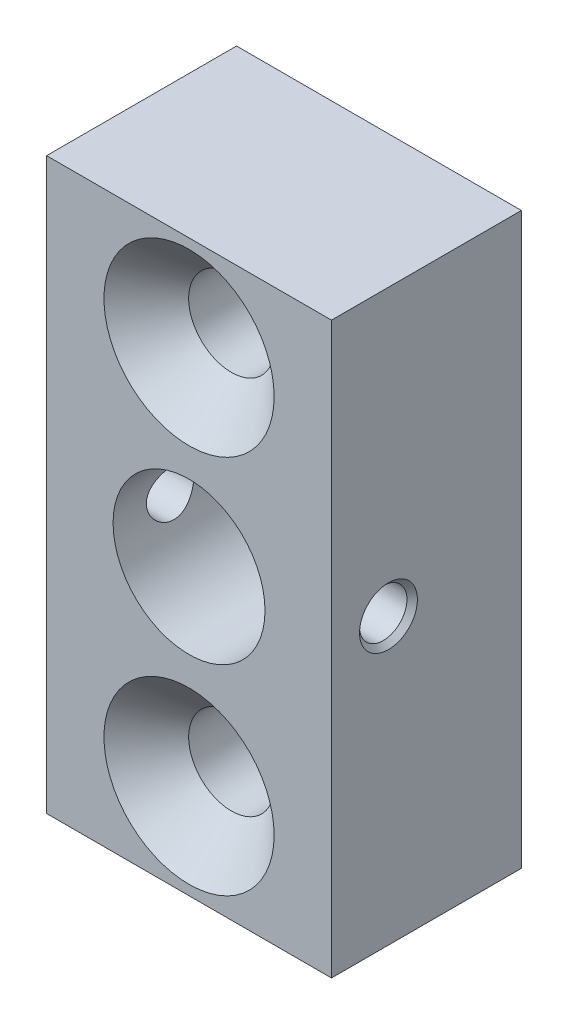
ISO-10303-21;
HEADER;
FILE_DESCRIPTION(('STEP AP214'),'2;1');
FILE_NAME('part.step','',(''),(''),'','','');
FILE_SCHEMA(('AUTOMOTIVE_DESIGN { 1 0 10303 214 1 1 1 1 }'));
ENDSEC;
DATA;
#1=APPLICATION_CONTEXT('core data for automotive mechanical design processes');
#2=APPLICATION_PROTOCOL_DEFINITION('international standard','automotive_design',2000,#1);
#3=PRODUCT_CONTEXT('',#1,'mechanical');
#4=PRODUCT('Part','Part','',(#3));
#5=PRODUCT_RELATED_PRODUCT_CATEGORY('part','',(#4));
#6=PRODUCT_DEFINITION_FORMATION('','',#4);
#7=PRODUCT_DEFINITION_CONTEXT('part definition',#1,'design');
#8=PRODUCT_DEFINITION('design','',#6,#7);
#9=PRODUCT_DEFINITION_SHAPE('','',#8);
#10=(LENGTH_UNIT() NAMED_UNIT(*) SI_UNIT(.MILLI.,.METRE.));
#11=(NAMED_UNIT(*) PLANE_ANGLE_UNIT() SI_UNIT($,.RADIAN.));
#12=(NAMED_UNIT(*) SI_UNIT($,.STERADIAN.) SOLID_ANGLE_UNIT());
#13=UNCERTAINTY_MEASURE_WITH_UNIT(LENGTH_MEASURE(1.E-05),#10,'distance_accuracy_value','');
#14=(GEOMETRIC_REPRESENTATION_CONTEXT(3) GLOBAL_UNCERTAINTY_ASSIGNED_CONTEXT((#13)) GLOBAL_UNIT_ASSIGNED_CONTEXT((#10,
#11,#12)) REPRESENTATION_CONTEXT('',''));
#15=CARTESIAN_POINT('',(0.,0.,0.));
#16=DIRECTION('',(0.,0.,1.));
#17=DIRECTION('',(1.,0.,0.));
#18=AXIS2_PLACEMENT_3D('',#15,#16,#17);
#19=CARTESIAN_POINT('',(7.5,5.,10.));
#20=DIRECTION('',(0.,0.,1.));
#21=DIRECTION('',(1.,0.,0.));
#22=AXIS2_PLACEMENT_3D('',#19,#20,#21);
#23=CYLINDRICAL_SURFACE('',#22,2.25);
#24=CARTESIAN_POINT('',(7.5,5.,7.77));
#25=DIRECTION('',(0.,0.,1.));
#26=DIRECTION('',(1.,0.,0.));
#27=AXIS2_PLACEMENT_3D('',#24,#25,#26);
#28=CIRCLE('',#27,2.25);
#29=CARTESIAN_POINT('',(9.75,5.,7.77));
#30=VERTEX_POINT('',#29);
#31=EDGE_CURVE('E120',#30,#30,#28,.T.);
#32=ORIENTED_EDGE('',*,*,#31,.T.);
#33=EDGE_LOOP('',(#32));
#34=FACE_BOUND('',#33,.T.);
#35=CARTESIAN_POINT('',(7.5,5.,4.));
#36=DIRECTION('',(0.,0.,-1.));
#37=DIRECTION('',(-1.,0.,0.));
#38=AXIS2_PLACEMENT_3D('',#35,#36,#37);
#39=CIRCLE('',#38,2.25);
#40=CARTESIAN_POINT('',(5.25,5.,4.));
#41=VERTEX_POINT('',#40);
#42=EDGE_CURVE('E129',#41,#41,#39,.F.);
#43=ORIENTED_EDGE('',*,*,#42,.F.);
#44=EDGE_LOOP('',(#43));
#45=FACE_BOUND('',#44,.T.);
#46=ADVANCED_FACE('F45',(#34,#45),#23,.F.);
#47=CARTESIAN_POINT('',(7.5,25.,10.));
#48=DIRECTION('',(0.,0.,1.));
#49=DIRECTION('',(1.,0.,0.));
#50=AXIS2_PLACEMENT_3D('',#47,#48,#49);
#51=CYLINDRICAL_SURFACE('',#50,2.25);
#52=CARTESIAN_POINT('',(7.5,25.,7.77));
#53=DIRECTION('',(0.,0.,1.));
#54=DIRECTION('',(1.,0.,0.));
#55=AXIS2_PLACEMENT_3D('',#52,#53,#54);
#56=CIRCLE('',#55,2.25);
#57=CARTESIAN_POINT('',(9.74999999999999,25.,7.77));
#58=VERTEX_POINT('',#57);
#59=EDGE_CURVE('E206',#58,#58,#56,.T.);
#60=ORIENTED_EDGE('',*,*,#59,.T.);
#61=EDGE_LOOP('',(#60));
#62=FACE_BOUND('',#61,.T.);
#63=CARTESIAN_POINT('',(7.5,25.,4.));
#64=DIRECTION('',(0.,0.,-1.));
#65=DIRECTION('',(-1.,0.,0.));
#66=AXIS2_PLACEMENT_3D('',#63,#64,#65);
#67=CIRCLE('',#66,2.25);
#68=CARTESIAN_POINT('',(5.25,25.,4.));
#69=VERTEX_POINT('',#68);
#70=EDGE_CURVE('E126',#69,#69,#67,.F.);
#71=ORIENTED_EDGE('',*,*,#70,.F.);
#72=EDGE_LOOP('',(#71));
#73=FACE_BOUND('',#72,.T.);
#74=ADVANCED_FACE('F165',(#62,#73),#51,.F.);
#75=CARTESIAN_POINT('',(0.,0.,0.));
#76=DIRECTION('',(0.,0.,-1.));
#77=DIRECTION('',(-1.,0.,0.));
#78=AXIS2_PLACEMENT_3D('',#75,#76,#77);
#79=PLANE('',#78);
#80=CARTESIAN_POINT('',(7.5,25.,0.));
#81=DIRECTION('',(0.,0.,-1.));
#82=DIRECTION('',(-1.,0.,0.));
#83=AXIS2_PLACEMENT_3D('',#80,#81,#82);
#84=CIRCLE('',#83,3.1);
#85=CARTESIAN_POINT('',(4.39999999999999,25.,0.));
#86=VERTEX_POINT('',#85);
#87=EDGE_CURVE('E218',#86,#86,#84,.T.);
#88=ORIENTED_EDGE('',*,*,#87,.F.);
#89=EDGE_LOOP('',(#88));
#90=FACE_BOUND('',#89,.T.);
#91=CARTESIAN_POINT('',(7.5,5.,0.));
#92=DIRECTION('',(0.,0.,-1.));
#93=DIRECTION('',(-1.,0.,0.));
#94=AXIS2_PLACEMENT_3D('',#91,#92,#93);
#95=CIRCLE('',#94,3.1);
#96=CARTESIAN_POINT('',(4.4,5.,0.));
#97=VERTEX_POINT('',#96);
#98=EDGE_CURVE('E211',#97,#97,#95,.T.);
#99=ORIENTED_EDGE('',*,*,#98,.F.);
#100=EDGE_LOOP('',(#99));
#101=FACE_BOUND('',#100,.T.);
#102=DIRECTION('',(0.,-1.,0.));
#103=VECTOR('',#102,1.);
#104=CARTESIAN_POINT('',(0.,0.,0.));
#105=LINE('',#104,#103);
#106=CARTESIAN_POINT('',(0.,30.,0.));
#107=VERTEX_POINT('',#106);
#108=CARTESIAN_POINT('',(0.,0.,0.));
#109=VERTEX_POINT('',#108);
#110=EDGE_CURVE('E117',#107,#109,#105,.T.);
#111=ORIENTED_EDGE('',*,*,#110,.F.);
#112=DIRECTION('',(-1.,0.,0.));
#113=VECTOR('',#112,1.);
#114=CARTESIAN_POINT('',(0.,30.,0.));
#115=LINE('',#114,#113);
#116=CARTESIAN_POINT('',(15.,30.,0.));
#117=VERTEX_POINT('',#116);
#118=EDGE_CURVE('E92',#117,#107,#115,.T.);
#119=ORIENTED_EDGE('',*,*,#118,.F.);
#120=DIRECTION('',(0.,1.,0.));
#121=VECTOR('',#120,1.);
#122=CARTESIAN_POINT('',(15.,0.,0.));
#123=LINE('',#122,#121);
#124=CARTESIAN_POINT('',(15.,0.,0.));
#125=VERTEX_POINT('',#124);
#126=EDGE_CURVE('E86',#125,#117,#123,.T.);
#127=ORIENTED_EDGE('',*,*,#126,.F.);
#128=DIRECTION('',(1.,0.,0.));
#129=VECTOR('',#128,1.);
#130=CARTESIAN_POINT('',(0.,0.,0.));
#131=LINE('',#130,#129);
#132=EDGE_CURVE('E108',#109,#125,#131,.T.);
#133=ORIENTED_EDGE('',*,*,#132,.F.);
#134=EDGE_LOOP('',(#111,#119,#127,#133));
#135=FACE_BOUND('',#134,.T.);
#136=ADVANCED_FACE('F172',(#90,#101,#135),#79,.T.);
#137=CARTESIAN_POINT('',(0.,0.,10.));
#138=DIRECTION('',(1.,0.,0.));
#139=DIRECTION('',(0.,0.,-1.));
#140=AXIS2_PLACEMENT_3D('',#137,#138,#139);
#141=PLANE('',#140);
#142=CARTESIAN_POINT('',(0.,15.,7.00000000000001));
#143=DIRECTION('',(1.,0.,0.));
#144=DIRECTION('',(0.,0.,-1.));
#145=AXIS2_PLACEMENT_3D('',#142,#143,#144);
#146=CIRCLE('',#145,1.25);
#147=CARTESIAN_POINT('',(0.,15.,5.75000000000001));
#148=VERTEX_POINT('',#147);
#149=EDGE_CURVE('E138',#148,#148,#146,.T.);
#150=ORIENTED_EDGE('',*,*,#149,.T.);
#151=EDGE_LOOP('',(#150));
#152=FACE_BOUND('',#151,.T.);
#153=ORIENTED_EDGE('',*,*,#110,.T.);
#154=DIRECTION('',(0.,0.,-1.));
#155=VECTOR('',#154,1.);
#156=CARTESIAN_POINT('',(0.,0.,10.));
#157=LINE('',#156,#155);
#158=CARTESIAN_POINT('',(0.,0.,10.));
#159=VERTEX_POINT('',#158);
#160=EDGE_CURVE('E11',#159,#109,#157,.T.);
#161=ORIENTED_EDGE('',*,*,#160,.F.);
#162=DIRECTION('',(0.,-1.,0.));
#163=VECTOR('',#162,1.);
#164=CARTESIAN_POINT('',(0.,0.,10.));
#165=LINE('',#164,#163);
#166=CARTESIAN_POINT('',(0.,30.,10.));
#167=VERTEX_POINT('',#166);
#168=EDGE_CURVE('E104',#167,#159,#165,.T.);
#169=ORIENTED_EDGE('',*,*,#168,.F.);
#170=DIRECTION('',(0.,0.,-1.));
#171=VECTOR('',#170,1.);
#172=CARTESIAN_POINT('',(0.,30.,10.));
#173=LINE('',#172,#171);
#174=EDGE_CURVE('E113',#167,#107,#173,.T.);
#175=ORIENTED_EDGE('',*,*,#174,.T.);
#176=EDGE_LOOP('',(#153,#161,#169,#175));
#177=FACE_BOUND('',#176,.T.);
#178=ADVANCED_FACE('F47',(#152,#177),#141,.F.);
#179=CARTESIAN_POINT('',(0.,0.,10.));
#180=DIRECTION('',(0.,1.,0.));
#181=DIRECTION('',(0.,0.,1.));
#182=AXIS2_PLACEMENT_3D('',#179,#180,#181);
#183=PLANE('',#182);
#184=ORIENTED_EDGE('',*,*,#132,.T.);
#185=DIRECTION('',(0.,0.,-1.));
#186=VECTOR('',#185,1.);
#187=CARTESIAN_POINT('',(15.,0.,10.));
#188=LINE('',#187,#186);
#189=CARTESIAN_POINT('',(15.,0.,10.));
#190=VERTEX_POINT('',#189);
#191=EDGE_CURVE('E60',#190,#125,#188,.T.);
#192=ORIENTED_EDGE('',*,*,#191,.F.);
#193=DIRECTION('',(1.,0.,0.));
#194=VECTOR('',#193,1.);
#195=CARTESIAN_POINT('',(0.,0.,10.));
#196=LINE('',#195,#194);
#197=EDGE_CURVE('E99',#159,#190,#196,.T.);
#198=ORIENTED_EDGE('',*,*,#197,.F.);
#199=ORIENTED_EDGE('',*,*,#160,.T.);
#200=EDGE_LOOP('',(#184,#192,#198,#199));
#201=FACE_BOUND('',#200,.T.);
#202=ADVANCED_FACE('F107',(#201),#183,.F.);
#203=CARTESIAN_POINT('',(15.,0.,10.));
#204=DIRECTION('',(-1.,0.,0.));
#205=DIRECTION('',(0.,0.,1.));
#206=AXIS2_PLACEMENT_3D('',#203,#204,#205);
#207=PLANE('',#206);
#208=CARTESIAN_POINT('',(15.,15.,7.00000000000001));
#209=DIRECTION('',(1.,0.,0.));
#210=DIRECTION('',(0.,0.,-1.));
#211=AXIS2_PLACEMENT_3D('',#208,#209,#210);
#212=CIRCLE('',#211,1.525);
#213=CARTESIAN_POINT('',(15.,15.,5.47500000000001));
#214=VERTEX_POINT('',#213);
#215=EDGE_CURVE('E231',#214,#214,#212,.T.);
#216=ORIENTED_EDGE('',*,*,#215,.F.);
#217=EDGE_LOOP('',(#216));
#218=FACE_BOUND('',#217,.T.);
#219=ORIENTED_EDGE('',*,*,#126,.T.);
#220=DIRECTION('',(0.,0.,-1.));
#221=VECTOR('',#220,1.);
#222=CARTESIAN_POINT('',(15.,30.,10.));
#223=LINE('',#222,#221);
#224=CARTESIAN_POINT('',(15.,30.,10.));
#225=VERTEX_POINT('',#224);
#226=EDGE_CURVE('E109',#225,#117,#223,.T.);
#227=ORIENTED_EDGE('',*,*,#226,.F.);
#228=DIRECTION('',(0.,1.,0.));
#229=VECTOR('',#228,1.);
#230=CARTESIAN_POINT('',(15.,0.,10.));
#231=LINE('',#230,#229);
#232=EDGE_CURVE('E102',#190,#225,#231,.T.);
#233=ORIENTED_EDGE('',*,*,#232,.F.);
#234=ORIENTED_EDGE('',*,*,#191,.T.);
#235=EDGE_LOOP('',(#219,#227,#233,#234));
#236=FACE_BOUND('',#235,.T.);
#237=ADVANCED_FACE('F111',(#218,#236),#207,.F.);
#238=CARTESIAN_POINT('',(0.,30.,10.));
#239=DIRECTION('',(0.,-1.,0.));
#240=DIRECTION('',(0.,0.,-1.));
#241=AXIS2_PLACEMENT_3D('',#238,#239,#240);
#242=PLANE('',#241);
#243=ORIENTED_EDGE('',*,*,#118,.T.);
#244=ORIENTED_EDGE('',*,*,#174,.F.);
#245=DIRECTION('',(-1.,0.,0.));
#246=VECTOR('',#245,1.);
#247=CARTESIAN_POINT('',(0.,30.,10.));
#248=LINE('',#247,#246);
#249=EDGE_CURVE('E69',#225,#167,#248,.T.);
#250=ORIENTED_EDGE('',*,*,#249,.F.);
#251=ORIENTED_EDGE('',*,*,#226,.T.);
#252=EDGE_LOOP('',(#243,#244,#250,#251));
#253=FACE_BOUND('',#252,.T.);
#254=ADVANCED_FACE('F181',(#253),#242,.F.);
#255=CARTESIAN_POINT('',(0.,0.,10.));
#256=DIRECTION('',(0.,0.,-1.));
#257=DIRECTION('',(-1.,0.,0.));
#258=AXIS2_PLACEMENT_3D('',#255,#256,#257);
#259=PLANE('',#258);
#260=CARTESIAN_POINT('',(7.5,15.,10.));
#261=DIRECTION('',(0.,0.,1.));
#262=DIRECTION('',(1.,0.,0.));
#263=AXIS2_PLACEMENT_3D('',#260,#261,#262);
#264=CIRCLE('',#263,4.);
#265=CARTESIAN_POINT('',(11.5,15.,10.));
#266=VERTEX_POINT('',#265);
#267=EDGE_CURVE('E223',#266,#266,#264,.T.);
#268=ORIENTED_EDGE('',*,*,#267,.F.);
#269=EDGE_LOOP('',(#268));
#270=FACE_BOUND('',#269,.T.);
#271=CARTESIAN_POINT('',(7.5,25.,10.));
#272=DIRECTION('',(0.,0.,1.));
#273=DIRECTION('',(1.,0.,0.));
#274=AXIS2_PLACEMENT_3D('',#271,#272,#273);
#275=CIRCLE('',#274,4.48);
#276=CARTESIAN_POINT('',(11.98,25.,10.));
#277=VERTEX_POINT('',#276);
#278=EDGE_CURVE('E132',#277,#277,#275,.T.);
#279=ORIENTED_EDGE('',*,*,#278,.F.);
#280=EDGE_LOOP('',(#279));
#281=FACE_BOUND('',#280,.T.);
#282=CARTESIAN_POINT('',(7.5,5.,10.));
#283=DIRECTION('',(0.,0.,1.));
#284=DIRECTION('',(1.,0.,0.));
#285=AXIS2_PLACEMENT_3D('',#282,#283,#284);
#286=CIRCLE('',#285,4.48);
#287=CARTESIAN_POINT('',(11.98,5.,10.));
#288=VERTEX_POINT('',#287);
#289=EDGE_CURVE('E203',#288,#288,#286,.T.);
#290=ORIENTED_EDGE('',*,*,#289,.F.);
#291=EDGE_LOOP('',(#290));
#292=FACE_BOUND('',#291,.T.);
#293=ORIENTED_EDGE('',*,*,#168,.T.);
#294=ORIENTED_EDGE('',*,*,#197,.T.);
#295=ORIENTED_EDGE('',*,*,#232,.T.);
#296=ORIENTED_EDGE('',*,*,#249,.T.);
#297=EDGE_LOOP('',(#293,#294,#295,#296));
#298=FACE_BOUND('',#297,.T.);
#299=ADVANCED_FACE('F100',(#270,#281,#292,#298),#259,.F.);
#300=CARTESIAN_POINT('',(7.5,5.,10.));
#301=DIRECTION('',(0.,0.,1.));
#302=DIRECTION('',(1.,0.,0.));
#303=AXIS2_PLACEMENT_3D('',#300,#301,#302);
#304=CONICAL_SURFACE('',#303,4.48,0.785398163397449);
#305=ORIENTED_EDGE('',*,*,#31,.F.);
#306=EDGE_LOOP('',(#305));
#307=FACE_BOUND('',#306,.T.);
#308=ORIENTED_EDGE('',*,*,#289,.T.);
#309=EDGE_LOOP('',(#308));
#310=FACE_BOUND('',#309,.T.);
#311=ADVANCED_FACE('F179',(#307,#310),#304,.F.);
#312=CARTESIAN_POINT('',(7.5,25.,10.));
#313=DIRECTION('',(0.,0.,1.));
#314=DIRECTION('',(1.,0.,0.));
#315=AXIS2_PLACEMENT_3D('',#312,#313,#314);
#316=CONICAL_SURFACE('',#315,4.48,0.785398163397449);
#317=ORIENTED_EDGE('',*,*,#59,.F.);
#318=EDGE_LOOP('',(#317));
#319=FACE_BOUND('',#318,.T.);
#320=ORIENTED_EDGE('',*,*,#278,.T.);
#321=EDGE_LOOP('',(#320));
#322=FACE_BOUND('',#321,.T.);
#323=ADVANCED_FACE('F256',(#319,#322),#316,.F.);
#324=CARTESIAN_POINT('',(7.5,25.,4.));
#325=DIRECTION('',(0.,0.,-1.));
#326=DIRECTION('',(-1.,0.,0.));
#327=AXIS2_PLACEMENT_3D('',#324,#325,#326);
#328=PLANE('',#327);
#329=CARTESIAN_POINT('',(7.5,25.,4.));
#330=DIRECTION('',(0.,0.,-1.));
#331=DIRECTION('',(-1.,0.,0.));
#332=AXIS2_PLACEMENT_3D('',#329,#330,#331);
#333=CIRCLE('',#332,3.1);
#334=CARTESIAN_POINT('',(4.39999999999999,25.,4.));
#335=VERTEX_POINT('',#334);
#336=EDGE_CURVE('E130',#335,#335,#333,.T.);
#337=ORIENTED_EDGE('',*,*,#336,.T.);
#338=EDGE_LOOP('',(#337));
#339=FACE_BOUND('',#338,.T.);
#340=ORIENTED_EDGE('',*,*,#70,.T.);
#341=EDGE_LOOP('',(#340));
#342=FACE_BOUND('',#341,.T.);
#343=ADVANCED_FACE('F260',(#339,#342),#328,.T.);
#344=CARTESIAN_POINT('',(7.5,25.,4.));
#345=DIRECTION('',(0.,0.,-1.));
#346=DIRECTION('',(-1.,0.,0.));
#347=AXIS2_PLACEMENT_3D('',#344,#345,#346);
#348=CYLINDRICAL_SURFACE('',#347,3.1);
#349=ORIENTED_EDGE('',*,*,#336,.F.);
#350=EDGE_LOOP('',(#349));
#351=FACE_BOUND('',#350,.T.);
#352=ORIENTED_EDGE('',*,*,#87,.T.);
#353=EDGE_LOOP('',(#352));
#354=FACE_BOUND('',#353,.T.);
#355=ADVANCED_FACE('F267',(#351,#354),#348,.F.);
#356=CARTESIAN_POINT('',(7.5,5.,4.));
#357=DIRECTION('',(0.,0.,-1.));
#358=DIRECTION('',(-1.,0.,0.));
#359=AXIS2_PLACEMENT_3D('',#356,#357,#358);
#360=PLANE('',#359);
#361=CARTESIAN_POINT('',(7.5,5.,4.));
#362=DIRECTION('',(0.,0.,-1.));
#363=DIRECTION('',(-1.,0.,0.));
#364=AXIS2_PLACEMENT_3D('',#361,#362,#363);
#365=CIRCLE('',#364,3.1);
#366=CARTESIAN_POINT('',(4.4,5.,4.));
#367=VERTEX_POINT('',#366);
#368=EDGE_CURVE('E214',#367,#367,#365,.T.);
#369=ORIENTED_EDGE('',*,*,#368,.T.);
#370=EDGE_LOOP('',(#369));
#371=FACE_BOUND('',#370,.T.);
#372=ORIENTED_EDGE('',*,*,#42,.T.);
#373=EDGE_LOOP('',(#372));
#374=FACE_BOUND('',#373,.T.);
#375=ADVANCED_FACE('F274',(#371,#374),#360,.T.);
#376=CARTESIAN_POINT('',(7.5,5.,4.));
#377=DIRECTION('',(0.,0.,-1.));
#378=DIRECTION('',(-1.,0.,0.));
#379=AXIS2_PLACEMENT_3D('',#376,#377,#378);
#380=CYLINDRICAL_SURFACE('',#379,3.1);
#381=ORIENTED_EDGE('',*,*,#368,.F.);
#382=EDGE_LOOP('',(#381));
#383=FACE_BOUND('',#382,.T.);
#384=ORIENTED_EDGE('',*,*,#98,.T.);
#385=EDGE_LOOP('',(#384));
#386=FACE_BOUND('',#385,.T.);
#387=ADVANCED_FACE('F161',(#383,#386),#380,.F.);
#388=CARTESIAN_POINT('',(7.5,15.,4.));
#389=DIRECTION('',(0.,0.,1.));
#390=DIRECTION('',(1.,0.,0.));
#391=AXIS2_PLACEMENT_3D('',#388,#389,#390);
#392=CYLINDRICAL_SURFACE('',#391,4.);
#393=CARTESIAN_POINT('',(11.5,15.,5.75000000000001));
#394=CARTESIAN_POINT('',(11.4999996587799,15.0684391851745,5.75000044658758));
#395=CARTESIAN_POINT('',(11.4982269498484,15.1368830525029,5.75563922694446));
#396=CARTESIAN_POINT('',(11.4913289408881,15.2717692095884,5.77798624153924));
#397=CARTESIAN_POINT('',(11.4862028819986,15.3382110427259,5.79469698136437));
#398=CARTESIAN_POINT('',(11.4731581569791,15.4671285436508,5.83856937119574));
#399=CARTESIAN_POINT('',(11.4652438149903,15.5296101769858,5.86571484465297));
#400=CARTESIAN_POINT('',(11.4474396916109,15.6491348023465,5.92961731767834));
#401=CARTESIAN_POINT('',(11.4375495989991,15.7061769354449,5.96637583178059));
#402=CARTESIAN_POINT('',(11.4165021374028,15.8149653349523,6.04965599201737));
#403=CARTESIAN_POINT('',(11.4053171592699,15.8665200281567,6.09642088506108));
#404=CARTESIAN_POINT('',(11.3831004637421,15.961197382037,6.19786839241356));
#405=CARTESIAN_POINT('',(11.3720687752346,16.0043184728987,6.25255247749456));
#406=CARTESIAN_POINT('',(11.3511114469817,16.0819433648311,6.36994456380809));
#407=CARTESIAN_POINT('',(11.341219883018,16.1162078415013,6.43281747752723));
#408=CARTESIAN_POINT('',(11.3240780179923,16.1735974107667,6.56379231498188));
#409=CARTESIAN_POINT('',(11.3168270212869,16.1967254377194,6.63189285579394));
#410=CARTESIAN_POINT('',(11.306076069845,16.2304845993003,6.76922807745207));
#411=CARTESIAN_POINT('',(11.3024697292951,16.2414711000786,6.83836684363886));
#412=CARTESIAN_POINT('',(11.2991005514095,16.2517455503699,6.9775931189119));
#413=CARTESIAN_POINT('',(11.2993366922733,16.2510366099577,7.04768037082167));
#414=CARTESIAN_POINT('',(11.3035318907544,16.2382182473274,7.18387446026899));
#415=CARTESIAN_POINT('',(11.3073434174595,16.2265605786938,7.25002912586157));
#416=CARTESIAN_POINT('',(11.3180202565249,16.1929081335563,7.37939215653735));
#417=CARTESIAN_POINT('',(11.3248858934312,16.1709122584455,7.4426002077088));
#418=CARTESIAN_POINT('',(11.341010440143,16.1168887468128,7.56535194443264));
#419=CARTESIAN_POINT('',(11.3503028466082,16.0847192566208,7.62482861069199));
#420=CARTESIAN_POINT('',(11.3702185658007,16.0113602073785,7.73768776787913));
#421=CARTESIAN_POINT('',(11.3808422239455,15.9701683052158,7.79106867025372));
#422=CARTESIAN_POINT('',(11.4028152780049,15.8777169541821,7.89277494341699));
#423=CARTESIAN_POINT('',(11.414175696057,15.8260845705928,7.94075955777969));
#424=CARTESIAN_POINT('',(11.4359157075958,15.7153644080955,8.02747189357968));
#425=CARTESIAN_POINT('',(11.4462952283837,15.656276077349,8.06619892921921));
#426=CARTESIAN_POINT('',(11.4650129489019,15.5316646104655,8.13352768860128));
#427=CARTESIAN_POINT('',(11.4733346064821,15.4660949069193,8.16204813546397));
#428=CARTESIAN_POINT('',(11.4868795582855,15.3307679777826,8.20755300085157));
#429=CARTESIAN_POINT('',(11.4921037932515,15.2610120307246,8.2245409222384));
#430=CARTESIAN_POINT('',(11.4987138939501,15.1221851572903,8.24591804257898));
#431=CARTESIAN_POINT('',(11.5002402289544,15.0531918487888,8.25076854359353));
#432=CARTESIAN_POINT('',(11.4996979973098,14.9153696942674,8.24903377336267));
#433=CARTESIAN_POINT('',(11.4976299558112,14.8465408256935,8.2424501726774));
#434=CARTESIAN_POINT('',(11.4902236376977,14.7127806670242,8.21840440739361));
#435=CARTESIAN_POINT('',(11.4849679311073,14.6477950215791,8.20121673238749));
#436=CARTESIAN_POINT('',(11.4718012137925,14.5216480711386,8.15678564763332));
#437=CARTESIAN_POINT('',(11.463889875142,14.460487239551,8.1295409959751));
#438=CARTESIAN_POINT('',(11.4459854275957,14.3420675933278,8.06502678345121));
#439=CARTESIAN_POINT('',(11.4359462681821,14.284940260212,8.02752901250279));
#440=CARTESIAN_POINT('',(11.4149341000289,14.1776341490399,7.94384678988299));
#441=CARTESIAN_POINT('',(11.4039608384586,14.1274572619567,7.89765998225689));
#442=CARTESIAN_POINT('',(11.3817699488525,14.0334125370803,7.79574110994632));
#443=CARTESIAN_POINT('',(11.3705598671445,13.9898734766023,7.73970333625475));
#444=CARTESIAN_POINT('',(11.349619470876,13.9127874975509,7.62087338362926));
#445=CARTESIAN_POINT('',(11.339889132814,13.8792404202748,7.55808131199557));
#446=CARTESIAN_POINT('',(11.3231178236075,13.8232991651886,7.42765482711414));
#447=CARTESIAN_POINT('',(11.3160664646803,13.8008618044111,7.36004035049531));
#448=CARTESIAN_POINT('',(11.3055117094121,13.7677710567904,7.22172750667621));
#449=CARTESIAN_POINT('',(11.3020069630268,13.7571131858539,7.15103032362869));
#450=CARTESIAN_POINT('',(11.2990829271249,13.7482059384246,7.01199591244576));
#451=CARTESIAN_POINT('',(11.2994860468308,13.7494172037804,6.94369654618707));
#452=CARTESIAN_POINT('',(11.3039009047238,13.7629118187053,6.80832541508083));
#453=CARTESIAN_POINT('',(11.3079124745732,13.7751946517744,6.741253593116));
#454=CARTESIAN_POINT('',(11.3189681415811,13.8101227008662,6.61120596039822));
#455=CARTESIAN_POINT('',(11.3259669818347,13.8326135759406,6.54818455890399));
#456=CARTESIAN_POINT('',(11.3421970426135,13.8871977266494,6.42675958646866));
#457=CARTESIAN_POINT('',(11.3514287171652,13.9192929555575,6.36835695792232));
#458=CARTESIAN_POINT('',(11.3715348703158,13.9936432498653,6.25535402955944));
#459=CARTESIAN_POINT('',(11.3824594892244,14.0362466647587,6.20099187049957));
#460=CARTESIAN_POINT('',(11.4044899882173,14.1297910035952,6.10001367188821));
#461=CARTESIAN_POINT('',(11.4155959160679,14.1807341576556,6.053399711009));
#462=CARTESIAN_POINT('',(11.4371727195233,14.2915133371767,5.96771746163702));
#463=CARTESIAN_POINT('',(11.4476110173063,14.3515854255126,5.92894526355004));
#464=CARTESIAN_POINT('',(11.4662676929692,14.4777208619863,5.86210108486057));
#465=CARTESIAN_POINT('',(11.4744869431583,14.5437818422046,5.83402489785817));
#466=CARTESIAN_POINT('',(11.4872065073346,14.674252364626,5.79140863239154));
#467=CARTESIAN_POINT('',(11.4919624080614,14.7383296628875,5.77592513269467));
#468=CARTESIAN_POINT('',(11.4983590034049,14.8682701045598,5.75522164003229));
#469=CARTESIAN_POINT('',(11.5000003283964,14.9341328838603,5.749999570196));
#470=CARTESIAN_POINT('',(11.5,15.,5.75000000000001));
#471=B_SPLINE_CURVE_WITH_KNOTS('',3,(#393,#394,#395,#396,#397,#398,#399,#400,#401,#402,#403,
#404,#405,#406,#407,#408,#409,#410,#411,#412,#413,#414,#415,#416,#417,#418,#419,#420,#421,#422,
#423,#424,#425,#426,#427,#428,#429,#430,#431,#432,#433,#434,#435,#436,#437,#438,#439,#440,#441,
#442,#443,#444,#445,#446,#447,#448,#449,#450,#451,#452,#453,#454,#455,#456,#457,#458,#459,#460,
#461,#462,#463,#464,#465,#466,#467,#468,#469,#470),.UNSPECIFIED.,.T.,.F.,(4,2,2,2,2,2,2,2,2,2,2,
2,2,2,2,2,2,2,2,2,2,2,2,2,2,2,2,2,2,2,2,2,2,2,2,2,2,2,4),(0.,0.20507544943251,0.410197323349066,
0.615002479202435,0.819839921558388,1.03037822195158,1.24095567431276,1.45673771247494,
1.67246286279527,1.88169150167209,2.09086450295138,2.29176917422169,2.49269519979062,
2.69655642720545,2.90047066010358,3.11366747279599,3.32688007413303,3.5417546068977,
3.75656384494553,3.96307568548236,4.16955735649362,4.37090626722871,4.57228005034499,
4.77856324738342,4.98490245709258,5.19941778713139,5.41392970983711,5.6276011575103,
5.8411912389243,6.04512203476053,6.24904331751084,6.4499791339667,6.65095584330173,
6.85979514006361,7.06869037373339,7.28440668126411,7.50003806666336,7.6974463665154,
7.89481470763046),.UNSPECIFIED.);
#472=CARTESIAN_POINT('',(11.5,15.,5.75000000000001));
#473=VERTEX_POINT('',#472);
#474=EDGE_CURVE('E49',#473,#473,#471,.T.);
#475=ORIENTED_EDGE('',*,*,#474,.T.);
#476=EDGE_LOOP('',(#475));
#477=FACE_BOUND('',#476,.T.);
#478=CARTESIAN_POINT('',(3.5,15.,5.75000000000001));
#479=CARTESIAN_POINT('',(3.50000034122011,14.9315608148255,5.75000044658758));
#480=CARTESIAN_POINT('',(3.50177305015159,14.8631169474971,5.75563922694446));
#481=CARTESIAN_POINT('',(3.50867105911193,14.7282307904116,5.77798624153924));
#482=CARTESIAN_POINT('',(3.51379711800141,14.6617889572741,5.79469698136437));
#483=CARTESIAN_POINT('',(3.52684184302091,14.5328714563492,5.83856937119574));
#484=CARTESIAN_POINT('',(3.53475618500975,14.4703898230142,5.86571484465298));
#485=CARTESIAN_POINT('',(3.55256030838907,14.3508651976535,5.92961731767834));
#486=CARTESIAN_POINT('',(3.56245040100095,14.2938230645551,5.96637583178059));
#487=CARTESIAN_POINT('',(3.58349786259718,14.1850346650477,6.04965599201737));
#488=CARTESIAN_POINT('',(3.59468284073011,14.1334799718433,6.09642088506108));
#489=CARTESIAN_POINT('',(3.61689953625792,14.038802617963,6.19786839241356));
#490=CARTESIAN_POINT('',(3.62793122476543,13.9956815271013,6.25255247749455));
#491=CARTESIAN_POINT('',(3.64888855301828,13.9180566351689,6.36994456380809));
#492=CARTESIAN_POINT('',(3.65878011698204,13.8837921584987,6.43281747752723));
#493=CARTESIAN_POINT('',(3.67592198200766,13.8264025892333,6.56379231498188));
#494=CARTESIAN_POINT('',(3.68317297871311,13.8032745622806,6.63189285579394));
#495=CARTESIAN_POINT('',(3.69392393015499,13.7695154006997,6.76922807745207));
#496=CARTESIAN_POINT('',(3.69753027070492,13.7585288999214,6.83836684363886));
#497=CARTESIAN_POINT('',(3.7008994485905,13.7482544496301,6.9775931189119));
#498=CARTESIAN_POINT('',(3.70066330772666,13.7489633900423,7.04768037082167));
#499=CARTESIAN_POINT('',(3.69646810924562,13.7617817526726,7.18387446026899));
#500=CARTESIAN_POINT('',(3.69265658254051,13.7734394213062,7.25002912586157));
#501=CARTESIAN_POINT('',(3.68197974347511,13.8070918664437,7.37939215653735));
#502=CARTESIAN_POINT('',(3.67511410656885,13.8290877415545,7.4426002077088));
#503=CARTESIAN_POINT('',(3.65898955985703,13.8831112531872,7.56535194443264));
#504=CARTESIAN_POINT('',(3.64969715339176,13.9152807433792,7.62482861069199));
#505=CARTESIAN_POINT('',(3.6297814341993,13.9886397926215,7.73768776787913));
#506=CARTESIAN_POINT('',(3.61915777605449,14.0298316947842,7.79106867025372));
#507=CARTESIAN_POINT('',(3.59718472199507,14.1222830458179,7.89277494341699));
#508=CARTESIAN_POINT('',(3.58582430394304,14.1739154294072,7.94075955777969));
#509=CARTESIAN_POINT('',(3.5640842924042,14.2846355919045,8.02747189357968));
#510=CARTESIAN_POINT('',(3.55370477161628,14.343723922651,8.06619892921921));
#511=CARTESIAN_POINT('',(3.53498705109809,14.4683353895345,8.13352768860128));
#512=CARTESIAN_POINT('',(3.52666539351792,14.5339050930807,8.16204813546397));
#513=CARTESIAN_POINT('',(3.51312044171446,14.6692320222174,8.20755300085157));
#514=CARTESIAN_POINT('',(3.50789620674849,14.7389879692754,8.2245409222384));
#515=CARTESIAN_POINT('',(3.50128610604986,14.8778148427097,8.24591804257898));
#516=CARTESIAN_POINT('',(3.49975977104561,14.9468081512112,8.25076854359353));
#517=CARTESIAN_POINT('',(3.50030200269019,15.0846303057326,8.24903377336267));
#518=CARTESIAN_POINT('',(3.50237004418875,15.1534591743065,8.2424501726774));
#519=CARTESIAN_POINT('',(3.50977636230228,15.2872193329759,8.21840440739361));
#520=CARTESIAN_POINT('',(3.51503206889275,15.3522049784209,8.20121673238749));
#521=CARTESIAN_POINT('',(3.52819878620748,15.4783519288614,8.15678564763332));
#522=CARTESIAN_POINT('',(3.53611012485797,15.539512760449,8.1295409959751));
#523=CARTESIAN_POINT('',(3.55401457240432,15.6579324066722,8.06502678345121));
#524=CARTESIAN_POINT('',(3.5640537318179,15.715059739788,8.02752901250278));
#525=CARTESIAN_POINT('',(3.58506589997113,15.8223658509601,7.94384678988299));
#526=CARTESIAN_POINT('',(3.59603916154138,15.8725427380433,7.89765998225689));
#527=CARTESIAN_POINT('',(3.61823005114753,15.9665874629197,7.79574110994632));
#528=CARTESIAN_POINT('',(3.62944013285554,16.0101265233977,7.73970333625475));
#529=CARTESIAN_POINT('',(3.65038052912398,16.0872125024491,7.62087338362926));
#530=CARTESIAN_POINT('',(3.660110867186,16.1207595797252,7.55808131199557));
#531=CARTESIAN_POINT('',(3.67688217639246,16.1767008348114,7.42765482711414));
#532=CARTESIAN_POINT('',(3.68393353531973,16.1991381955889,7.36004035049531));
#533=CARTESIAN_POINT('',(3.69448829058788,16.2322289432096,7.22172750667621));
#534=CARTESIAN_POINT('',(3.69799303697325,16.2428868141461,7.15103032362869));
#535=CARTESIAN_POINT('',(3.70091707287506,16.2517940615754,7.01199591244576));
#536=CARTESIAN_POINT('',(3.70051395316923,16.2505827962196,6.94369654618707));
#537=CARTESIAN_POINT('',(3.69609909527617,16.2370881812947,6.80832541508083));
#538=CARTESIAN_POINT('',(3.69208752542681,16.2248053482256,6.741253593116));
#539=CARTESIAN_POINT('',(3.68103185841888,16.1898772991338,6.61120596039822));
#540=CARTESIAN_POINT('',(3.67403301816526,16.1673864240594,6.54818455890399));
#541=CARTESIAN_POINT('',(3.65780295738652,16.1128022733506,6.42675958646865));
#542=CARTESIAN_POINT('',(3.64857128283478,16.0807070444425,6.36835695792232));
#543=CARTESIAN_POINT('',(3.6284651296842,16.0063567501347,6.25535402955944));
#544=CARTESIAN_POINT('',(3.61754051077559,15.9637533352413,6.20099187049957));
#545=CARTESIAN_POINT('',(3.59551001178274,15.8702089964048,6.10001367188821));
#546=CARTESIAN_POINT('',(3.58440408393205,15.8192658423444,6.053399711009));
#547=CARTESIAN_POINT('',(3.56282728047671,15.7084866628233,5.96771746163702));
#548=CARTESIAN_POINT('',(3.55238898269366,15.6484145744874,5.92894526355004));
#549=CARTESIAN_POINT('',(3.53373230703083,15.5222791380137,5.86210108486057));
#550=CARTESIAN_POINT('',(3.52551305684168,15.4562181577954,5.83402489785817));
#551=CARTESIAN_POINT('',(3.51279349266539,15.325747635374,5.79140863239154));
#552=CARTESIAN_POINT('',(3.50803759193861,15.2616703371125,5.77592513269467));
#553=CARTESIAN_POINT('',(3.50164099659514,15.1317298954402,5.75522164003229));
#554=CARTESIAN_POINT('',(3.49999967160356,15.0658671161397,5.749999570196));
#555=CARTESIAN_POINT('',(3.5,15.,5.75000000000001));
#556=B_SPLINE_CURVE_WITH_KNOTS('',3,(#478,#479,#480,#481,#482,#483,#484,#485,#486,#487,#488,
#489,#490,#491,#492,#493,#494,#495,#496,#497,#498,#499,#500,#501,#502,#503,#504,#505,#506,#507,
#508,#509,#510,#511,#512,#513,#514,#515,#516,#517,#518,#519,#520,#521,#522,#523,#524,#525,#526,
#527,#528,#529,#530,#531,#532,#533,#534,#535,#536,#537,#538,#539,#540,#541,#542,#543,#544,#545,
#546,#547,#548,#549,#550,#551,#552,#553,#554,#555),.UNSPECIFIED.,.T.,.F.,(4,2,2,2,2,2,2,2,2,2,2,
2,2,2,2,2,2,2,2,2,2,2,2,2,2,2,2,2,2,2,2,2,2,2,2,2,2,2,4),(0.,0.20507544943251,0.410197323349066,
0.61500247920244,0.819839921558392,1.03037822195158,1.24095567431276,1.45673771247494,
1.67246286279527,1.88169150167209,2.09086450295138,2.29176917422169,2.49269519979062,
2.69655642720545,2.90047066010358,3.11366747279599,3.32688007413303,3.54175460689769,
3.75656384494553,3.96307568548237,4.16955735649362,4.37090626722872,4.57228005034499,
4.77856324738342,4.98490245709259,5.19941778713139,5.41392970983711,5.6276011575103,
5.8411912389243,6.04512203476053,6.24904331751084,6.4499791339667,6.65095584330173,
6.85979514006361,7.0686903737334,7.28440668126412,7.50003806666336,7.6974463665154,
7.89481470763046),.UNSPECIFIED.);
#557=CARTESIAN_POINT('',(3.5,15.,5.75000000000001));
#558=VERTEX_POINT('',#557);
#559=EDGE_CURVE('E133',#558,#558,#556,.T.);
#560=ORIENTED_EDGE('',*,*,#559,.T.);
#561=EDGE_LOOP('',(#560));
#562=FACE_BOUND('',#561,.T.);
#563=CARTESIAN_POINT('',(7.5,15.,4.));
#564=DIRECTION('',(0.,0.,1.));
#565=DIRECTION('',(1.,0.,0.));
#566=AXIS2_PLACEMENT_3D('',#563,#564,#565);
#567=CIRCLE('',#566,4.);
#568=CARTESIAN_POINT('',(11.5,15.,4.));
#569=VERTEX_POINT('',#568);
#570=EDGE_CURVE('E215',#569,#569,#567,.T.);
#571=ORIENTED_EDGE('',*,*,#570,.F.);
#572=EDGE_LOOP('',(#571));
#573=FACE_BOUND('',#572,.T.);
#574=ORIENTED_EDGE('',*,*,#267,.T.);
#575=EDGE_LOOP('',(#574));
#576=FACE_BOUND('',#575,.T.);
#577=ADVANCED_FACE('F139',(#477,#562,#573,#576),#392,.F.);
#578=CARTESIAN_POINT('',(7.5,15.,4.));
#579=DIRECTION('',(0.,0.,1.));
#580=DIRECTION('',(1.,0.,0.));
#581=AXIS2_PLACEMENT_3D('',#578,#579,#580);
#582=PLANE('',#581);
#583=ORIENTED_EDGE('',*,*,#570,.T.);
#584=EDGE_LOOP('',(#583));
#585=FACE_BOUND('',#584,.T.);
#586=ADVANCED_FACE('F150',(#585),#582,.T.);
#587=CARTESIAN_POINT('',(15.,15.,7.00000000000001));
#588=DIRECTION('',(1.,0.,0.));
#589=DIRECTION('',(0.,0.,-1.));
#590=AXIS2_PLACEMENT_3D('',#587,#588,#589);
#591=CYLINDRICAL_SURFACE('',#590,1.25);
#592=ORIENTED_EDGE('',*,*,#149,.F.);
#593=EDGE_LOOP('',(#592));
#594=FACE_BOUND('',#593,.T.);
#595=ORIENTED_EDGE('',*,*,#559,.F.);
#596=EDGE_LOOP('',(#595));
#597=FACE_BOUND('',#596,.T.);
#598=ADVANCED_FACE('F148',(#594,#597),#591,.F.);
#599=CARTESIAN_POINT('',(14.725,15.,7.00000000000001));
#600=DIRECTION('',(1.,0.,0.));
#601=DIRECTION('',(0.,0.,-1.));
#602=AXIS2_PLACEMENT_3D('',#599,#600,#601);
#603=CIRCLE('',#602,1.25);
#604=CARTESIAN_POINT('',(14.725,15.,5.75000000000001));
#605=VERTEX_POINT('',#604);
#606=EDGE_CURVE('E228',#605,#605,#603,.T.);
#607=ORIENTED_EDGE('',*,*,#606,.T.);
#608=EDGE_LOOP('',(#607));
#609=FACE_BOUND('',#608,.T.);
#610=ORIENTED_EDGE('',*,*,#474,.F.);
#611=EDGE_LOOP('',(#610));
#612=FACE_BOUND('',#611,.T.);
#613=ADVANCED_FACE('F143',(#609,#612),#591,.F.);
#614=CARTESIAN_POINT('',(15.,15.,7.00000000000001));
#615=DIRECTION('',(1.,0.,0.));
#616=DIRECTION('',(0.,0.,-1.));
#617=AXIS2_PLACEMENT_3D('',#614,#615,#616);
#618=CONICAL_SURFACE('',#617,1.525,0.785398163397445);
#619=ORIENTED_EDGE('',*,*,#606,.F.);
#620=EDGE_LOOP('',(#619));
#621=FACE_BOUND('',#620,.T.);
#622=ORIENTED_EDGE('',*,*,#215,.T.);
#623=EDGE_LOOP('',(#622));
#624=FACE_BOUND('',#623,.T.);
#625=ADVANCED_FACE('F147',(#621,#624),#618,.F.);
#626=CLOSED_SHELL('',(#46,#74,#136,#178,#202,#237,#254,#299,#311,#323,#343,#355,#375,#387,#577,
#586,#598,#613,#625));
#627=MANIFOLD_SOLID_BREP('B2',#626);
#628=ADVANCED_BREP_SHAPE_REPRESENTATION('',(#18,#627),#14);
#629=SHAPE_DEFINITION_REPRESENTATION(#9,#628);
ENDSEC;
END-ISO-10303-21;
